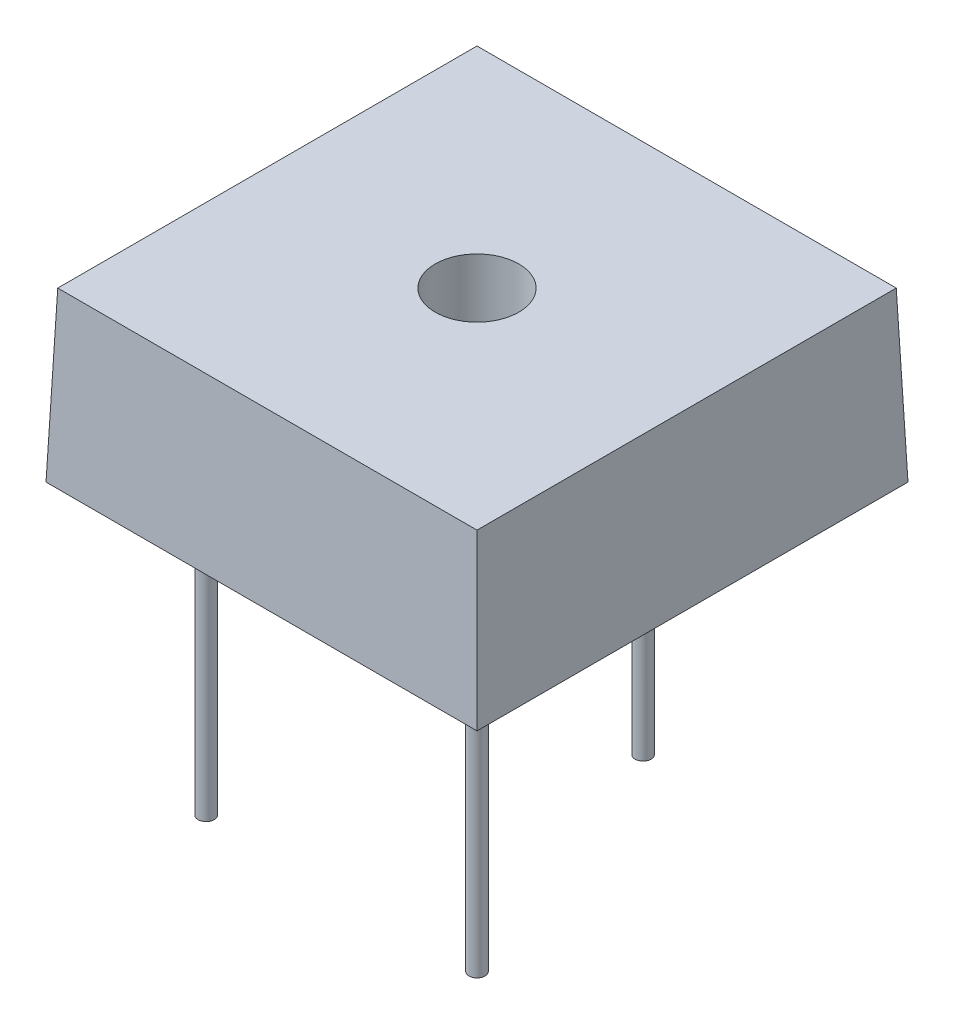
ISO-10303-21;
HEADER;
FILE_DESCRIPTION(('STEP AP214'),'2;1');
FILE_NAME('part.step','',(''),(''),'','','');
FILE_SCHEMA(('AUTOMOTIVE_DESIGN { 1 0 10303 214 1 1 1 1 }'));
ENDSEC;
DATA;
#1=APPLICATION_CONTEXT('core data for automotive mechanical design processes');
#2=APPLICATION_PROTOCOL_DEFINITION('international standard','automotive_design',2000,#1);
#3=PRODUCT_CONTEXT('',#1,'mechanical');
#4=PRODUCT('Part','Part','',(#3));
#5=PRODUCT_RELATED_PRODUCT_CATEGORY('part','',(#4));
#6=PRODUCT_DEFINITION_FORMATION('','',#4);
#7=PRODUCT_DEFINITION_CONTEXT('part definition',#1,'design');
#8=PRODUCT_DEFINITION('design','',#6,#7);
#9=PRODUCT_DEFINITION_SHAPE('','',#8);
#10=(LENGTH_UNIT() NAMED_UNIT(*) SI_UNIT(.MILLI.,.METRE.));
#11=(NAMED_UNIT(*) PLANE_ANGLE_UNIT() SI_UNIT($,.RADIAN.));
#12=(NAMED_UNIT(*) SI_UNIT($,.STERADIAN.) SOLID_ANGLE_UNIT());
#13=UNCERTAINTY_MEASURE_WITH_UNIT(LENGTH_MEASURE(1.E-05),#10,'distance_accuracy_value','');
#14=(GEOMETRIC_REPRESENTATION_CONTEXT(3) GLOBAL_UNCERTAINTY_ASSIGNED_CONTEXT((#13)) GLOBAL_UNIT_ASSIGNED_CONTEXT((#10,
#11,#12)) REPRESENTATION_CONTEXT('',''));
#15=CARTESIAN_POINT('',(0.,0.,0.));
#16=DIRECTION('',(0.,0.,1.));
#17=DIRECTION('',(1.,0.,0.));
#18=AXIS2_PLACEMENT_3D('',#15,#16,#17);
#19=CARTESIAN_POINT('',(0.,0.,-14.4));
#20=DIRECTION('',(0.,0.034899496702501,-0.999390827019096));
#21=DIRECTION('',(0.,0.999390827019096,0.034899496702501));
#22=AXIS2_PLACEMENT_3D('',#19,#20,#21);
#23=PLANE('',#22);
#24=DIRECTION('',(1.,0.,0.));
#25=VECTOR('',#24,1.);
#26=CARTESIAN_POINT('',(0.,0.,-14.4));
#27=LINE('',#26,#25);
#28=CARTESIAN_POINT('',(-14.4,0.,-14.4));
#29=VERTEX_POINT('',#28);
#30=CARTESIAN_POINT('',(14.4,0.,-14.4));
#31=VERTEX_POINT('',#30);
#32=EDGE_CURVE('E141',#29,#31,#27,.T.);
#33=ORIENTED_EDGE('',*,*,#32,.F.);
#34=DIRECTION('',(-0.0348782627423747,-0.998782765958718,-0.0348782627423747));
#35=VECTOR('',#34,1.);
#36=CARTESIAN_POINT('',(-14.3824824977483,0.50163563136476,-14.3824824977483));
#37=LINE('',#36,#35);
#38=CARTESIAN_POINT('',(-14.0078397586077,11.23,-14.0078397586077));
#39=VERTEX_POINT('',#38);
#40=EDGE_CURVE('E156',#39,#29,#37,.T.);
#41=ORIENTED_EDGE('',*,*,#40,.F.);
#42=DIRECTION('',(1.,0.,0.));
#43=VECTOR('',#42,1.);
#44=CARTESIAN_POINT('',(0.,11.23,-14.0078397586077));
#45=LINE('',#44,#43);
#46=CARTESIAN_POINT('',(14.0078397586077,11.23,-14.0078397586077));
#47=VERTEX_POINT('',#46);
#48=EDGE_CURVE('E155',#39,#47,#45,.T.);
#49=ORIENTED_EDGE('',*,*,#48,.T.);
#50=DIRECTION('',(-0.0348782627423747,0.998782765958718,0.0348782627423747));
#51=VECTOR('',#50,1.);
#52=CARTESIAN_POINT('',(14.3824824977483,0.50163563136476,-14.3824824977483));
#53=LINE('',#52,#51);
#54=EDGE_CURVE('E160',#47,#31,#53,.F.);
#55=ORIENTED_EDGE('',*,*,#54,.T.);
#56=EDGE_LOOP('',(#33,#41,#49,#55));
#57=FACE_BOUND('',#56,.T.);
#58=ADVANCED_FACE('F36',(#57),#23,.T.);
#59=CARTESIAN_POINT('',(-14.4,0.,0.));
#60=DIRECTION('',(-0.999390827019096,0.034899496702501,0.));
#61=DIRECTION('',(-0.034899496702501,-0.999390827019096,0.));
#62=AXIS2_PLACEMENT_3D('',#59,#60,#61);
#63=PLANE('',#62);
#64=DIRECTION('',(0.,0.,-1.));
#65=VECTOR('',#64,1.);
#66=CARTESIAN_POINT('',(-14.4,0.,0.));
#67=LINE('',#66,#65);
#68=CARTESIAN_POINT('',(-14.4,0.,14.4));
#69=VERTEX_POINT('',#68);
#70=EDGE_CURVE('E147',#69,#29,#67,.T.);
#71=ORIENTED_EDGE('',*,*,#70,.F.);
#72=DIRECTION('',(0.0348782627423747,0.998782765958718,-0.0348782627423747));
#73=VECTOR('',#72,1.);
#74=CARTESIAN_POINT('',(-14.3824824977483,0.50163563136476,14.3824824977483));
#75=LINE('',#74,#73);
#76=CARTESIAN_POINT('',(-14.0078397586077,11.23,14.0078397586077));
#77=VERTEX_POINT('',#76);
#78=EDGE_CURVE('E159',#77,#69,#75,.F.);
#79=ORIENTED_EDGE('',*,*,#78,.F.);
#80=DIRECTION('',(0.,0.,-1.));
#81=VECTOR('',#80,1.);
#82=CARTESIAN_POINT('',(-14.0078397586077,11.23,0.));
#83=LINE('',#82,#81);
#84=EDGE_CURVE('E168',#77,#39,#83,.T.);
#85=ORIENTED_EDGE('',*,*,#84,.T.);
#86=ORIENTED_EDGE('',*,*,#40,.T.);
#87=EDGE_LOOP('',(#71,#79,#85,#86));
#88=FACE_BOUND('',#87,.T.);
#89=ADVANCED_FACE('F38',(#88),#63,.T.);
#90=CARTESIAN_POINT('',(0.,0.,14.4));
#91=DIRECTION('',(0.,0.034899496702501,0.999390827019096));
#92=DIRECTION('',(0.,-0.999390827019096,0.034899496702501));
#93=AXIS2_PLACEMENT_3D('',#90,#91,#92);
#94=PLANE('',#93);
#95=DIRECTION('',(1.,0.,0.));
#96=VECTOR('',#95,1.);
#97=CARTESIAN_POINT('',(0.,0.,14.4));
#98=LINE('',#97,#96);
#99=CARTESIAN_POINT('',(14.4,0.,14.4));
#100=VERTEX_POINT('',#99);
#101=EDGE_CURVE('E150',#69,#100,#98,.T.);
#102=ORIENTED_EDGE('',*,*,#101,.T.);
#103=DIRECTION('',(0.0348782627423747,-0.998782765958718,0.0348782627423747));
#104=VECTOR('',#103,1.);
#105=CARTESIAN_POINT('',(14.3824824977483,0.50163563136476,14.3824824977483));
#106=LINE('',#105,#104);
#107=CARTESIAN_POINT('',(14.0078397586077,11.23,14.0078397586077));
#108=VERTEX_POINT('',#107);
#109=EDGE_CURVE('E162',#108,#100,#106,.T.);
#110=ORIENTED_EDGE('',*,*,#109,.F.);
#111=DIRECTION('',(-1.,0.,0.));
#112=VECTOR('',#111,1.);
#113=CARTESIAN_POINT('',(0.,11.23,14.0078397586077));
#114=LINE('',#113,#112);
#115=EDGE_CURVE('E171',#77,#108,#114,.F.);
#116=ORIENTED_EDGE('',*,*,#115,.F.);
#117=ORIENTED_EDGE('',*,*,#78,.T.);
#118=EDGE_LOOP('',(#102,#110,#116,#117));
#119=FACE_BOUND('',#118,.T.);
#120=ADVANCED_FACE('F234',(#119),#94,.T.);
#121=CARTESIAN_POINT('',(14.4,0.,0.));
#122=DIRECTION('',(0.999390827019096,0.034899496702501,0.));
#123=DIRECTION('',(-0.034899496702501,0.999390827019096,0.));
#124=AXIS2_PLACEMENT_3D('',#121,#122,#123);
#125=PLANE('',#124);
#126=DIRECTION('',(0.,0.,-1.));
#127=VECTOR('',#126,1.);
#128=CARTESIAN_POINT('',(14.4,0.,0.));
#129=LINE('',#128,#127);
#130=EDGE_CURVE('E152',#100,#31,#129,.T.);
#131=ORIENTED_EDGE('',*,*,#130,.T.);
#132=ORIENTED_EDGE('',*,*,#54,.F.);
#133=DIRECTION('',(0.,0.,1.));
#134=VECTOR('',#133,1.);
#135=CARTESIAN_POINT('',(14.0078397586077,11.23,0.));
#136=LINE('',#135,#134);
#137=EDGE_CURVE('E59',#108,#47,#136,.F.);
#138=ORIENTED_EDGE('',*,*,#137,.F.);
#139=ORIENTED_EDGE('',*,*,#109,.T.);
#140=EDGE_LOOP('',(#131,#132,#138,#139));
#141=FACE_BOUND('',#140,.T.);
#142=ADVANCED_FACE('F241',(#141),#125,.T.);
#143=CARTESIAN_POINT('',(0.,11.23,0.));
#144=DIRECTION('',(0.,1.,0.));
#145=DIRECTION('',(0.,0.,1.));
#146=AXIS2_PLACEMENT_3D('',#143,#144,#145);
#147=PLANE('',#146);
#148=CARTESIAN_POINT('',(0.,11.23,0.));
#149=DIRECTION('',(0.,-1.,0.));
#150=DIRECTION('',(0.,0.,-1.));
#151=AXIS2_PLACEMENT_3D('',#148,#149,#150);
#152=CIRCLE('',#151,2.795);
#153=CARTESIAN_POINT('',(0.,11.23,-2.795));
#154=VERTEX_POINT('',#153);
#155=EDGE_CURVE('E197',#154,#154,#152,.T.);
#156=ORIENTED_EDGE('',*,*,#155,.T.);
#157=EDGE_LOOP('',(#156));
#158=FACE_BOUND('',#157,.T.);
#159=ORIENTED_EDGE('',*,*,#48,.F.);
#160=ORIENTED_EDGE('',*,*,#84,.F.);
#161=ORIENTED_EDGE('',*,*,#115,.T.);
#162=ORIENTED_EDGE('',*,*,#137,.T.);
#163=EDGE_LOOP('',(#159,#160,#161,#162));
#164=FACE_BOUND('',#163,.T.);
#165=ADVANCED_FACE('F243',(#158,#164),#147,.T.);
#166=CARTESIAN_POINT('',(0.,0.,0.));
#167=DIRECTION('',(0.,1.,0.));
#168=DIRECTION('',(0.,0.,1.));
#169=AXIS2_PLACEMENT_3D('',#166,#167,#168);
#170=PLANE('',#169);
#171=DIRECTION('',(1.,0.,0.));
#172=VECTOR('',#171,1.);
#173=CARTESIAN_POINT('',(-13.4,0.,-13.4));
#174=LINE('',#173,#172);
#175=CARTESIAN_POINT('',(-13.4,0.,-13.4));
#176=VERTEX_POINT('',#175);
#177=CARTESIAN_POINT('',(13.4,0.,-13.4));
#178=VERTEX_POINT('',#177);
#179=EDGE_CURVE('E134',#176,#178,#174,.T.);
#180=ORIENTED_EDGE('',*,*,#179,.F.);
#181=DIRECTION('',(0.,0.,-1.));
#182=VECTOR('',#181,1.);
#183=CARTESIAN_POINT('',(-13.4,0.,13.4));
#184=LINE('',#183,#182);
#185=CARTESIAN_POINT('',(-13.4,0.,13.4));
#186=VERTEX_POINT('',#185);
#187=EDGE_CURVE('E51',#186,#176,#184,.T.);
#188=ORIENTED_EDGE('',*,*,#187,.F.);
#189=DIRECTION('',(-1.,0.,0.));
#190=VECTOR('',#189,1.);
#191=CARTESIAN_POINT('',(13.4,0.,13.4));
#192=LINE('',#191,#190);
#193=CARTESIAN_POINT('',(13.4,0.,13.4));
#194=VERTEX_POINT('',#193);
#195=EDGE_CURVE('E122',#194,#186,#192,.T.);
#196=ORIENTED_EDGE('',*,*,#195,.F.);
#197=DIRECTION('',(0.,0.,1.));
#198=VECTOR('',#197,1.);
#199=CARTESIAN_POINT('',(13.4,0.,-13.4));
#200=LINE('',#199,#198);
#201=EDGE_CURVE('E125',#178,#194,#200,.T.);
#202=ORIENTED_EDGE('',*,*,#201,.F.);
#203=EDGE_LOOP('',(#180,#188,#196,#202));
#204=FACE_BOUND('',#203,.T.);
#205=ORIENTED_EDGE('',*,*,#32,.T.);
#206=ORIENTED_EDGE('',*,*,#130,.F.);
#207=ORIENTED_EDGE('',*,*,#101,.F.);
#208=ORIENTED_EDGE('',*,*,#70,.T.);
#209=EDGE_LOOP('',(#205,#206,#207,#208));
#210=FACE_BOUND('',#209,.T.);
#211=ADVANCED_FACE('F239',(#204,#210),#170,.F.);
#212=CARTESIAN_POINT('',(-13.4,0.5,13.4));
#213=DIRECTION('',(-1.,0.,0.));
#214=DIRECTION('',(0.,0.,1.));
#215=AXIS2_PLACEMENT_3D('',#212,#213,#214);
#216=PLANE('',#215);
#217=ORIENTED_EDGE('',*,*,#187,.T.);
#218=DIRECTION('',(0.,-1.,0.));
#219=VECTOR('',#218,1.);
#220=CARTESIAN_POINT('',(-13.4,0.5,-13.4));
#221=LINE('',#220,#219);
#222=CARTESIAN_POINT('',(-13.4,0.5,-13.4));
#223=VERTEX_POINT('',#222);
#224=EDGE_CURVE('E100',#223,#176,#221,.T.);
#225=ORIENTED_EDGE('',*,*,#224,.F.);
#226=DIRECTION('',(0.,0.,-1.));
#227=VECTOR('',#226,1.);
#228=CARTESIAN_POINT('',(-13.4,0.5,13.4));
#229=LINE('',#228,#227);
#230=CARTESIAN_POINT('',(-13.4,0.5,13.4));
#231=VERTEX_POINT('',#230);
#232=EDGE_CURVE('E104',#231,#223,#229,.T.);
#233=ORIENTED_EDGE('',*,*,#232,.F.);
#234=DIRECTION('',(0.,-1.,0.));
#235=VECTOR('',#234,1.);
#236=CARTESIAN_POINT('',(-13.4,0.5,13.4));
#237=LINE('',#236,#235);
#238=EDGE_CURVE('E139',#231,#186,#237,.T.);
#239=ORIENTED_EDGE('',*,*,#238,.T.);
#240=EDGE_LOOP('',(#217,#225,#233,#239));
#241=FACE_BOUND('',#240,.T.);
#242=ADVANCED_FACE('F102',(#241),#216,.F.);
#243=CARTESIAN_POINT('',(13.4,0.5,13.4));
#244=DIRECTION('',(0.,0.,1.));
#245=DIRECTION('',(1.,0.,0.));
#246=AXIS2_PLACEMENT_3D('',#243,#244,#245);
#247=PLANE('',#246);
#248=ORIENTED_EDGE('',*,*,#195,.T.);
#249=ORIENTED_EDGE('',*,*,#238,.F.);
#250=DIRECTION('',(-1.,0.,0.));
#251=VECTOR('',#250,1.);
#252=CARTESIAN_POINT('',(13.4,0.5,13.4));
#253=LINE('',#252,#251);
#254=CARTESIAN_POINT('',(13.4,0.5,13.4));
#255=VERTEX_POINT('',#254);
#256=EDGE_CURVE('E110',#255,#231,#253,.T.);
#257=ORIENTED_EDGE('',*,*,#256,.F.);
#258=DIRECTION('',(0.,-1.,0.));
#259=VECTOR('',#258,1.);
#260=CARTESIAN_POINT('',(13.4,0.5,13.4));
#261=LINE('',#260,#259);
#262=EDGE_CURVE('E142',#255,#194,#261,.T.);
#263=ORIENTED_EDGE('',*,*,#262,.T.);
#264=EDGE_LOOP('',(#248,#249,#257,#263));
#265=FACE_BOUND('',#264,.T.);
#266=ADVANCED_FACE('F266',(#265),#247,.F.);
#267=CARTESIAN_POINT('',(13.4,0.5,-13.4));
#268=DIRECTION('',(1.,0.,0.));
#269=DIRECTION('',(0.,0.,-1.));
#270=AXIS2_PLACEMENT_3D('',#267,#268,#269);
#271=PLANE('',#270);
#272=ORIENTED_EDGE('',*,*,#201,.T.);
#273=ORIENTED_EDGE('',*,*,#262,.F.);
#274=DIRECTION('',(0.,0.,1.));
#275=VECTOR('',#274,1.);
#276=CARTESIAN_POINT('',(13.4,0.5,-13.4));
#277=LINE('',#276,#275);
#278=CARTESIAN_POINT('',(13.4,0.5,-13.4));
#279=VERTEX_POINT('',#278);
#280=EDGE_CURVE('E118',#279,#255,#277,.T.);
#281=ORIENTED_EDGE('',*,*,#280,.F.);
#282=DIRECTION('',(0.,-1.,0.));
#283=VECTOR('',#282,1.);
#284=CARTESIAN_POINT('',(13.4,0.5,-13.4));
#285=LINE('',#284,#283);
#286=EDGE_CURVE('E109',#279,#178,#285,.T.);
#287=ORIENTED_EDGE('',*,*,#286,.T.);
#288=EDGE_LOOP('',(#272,#273,#281,#287));
#289=FACE_BOUND('',#288,.T.);
#290=ADVANCED_FACE('F269',(#289),#271,.F.);
#291=CARTESIAN_POINT('',(-13.4,0.5,-13.4));
#292=DIRECTION('',(0.,0.,-1.));
#293=DIRECTION('',(-1.,0.,0.));
#294=AXIS2_PLACEMENT_3D('',#291,#292,#293);
#295=PLANE('',#294);
#296=ORIENTED_EDGE('',*,*,#179,.T.);
#297=ORIENTED_EDGE('',*,*,#286,.F.);
#298=DIRECTION('',(1.,0.,0.));
#299=VECTOR('',#298,1.);
#300=CARTESIAN_POINT('',(-13.4,0.5,-13.4));
#301=LINE('',#300,#299);
#302=EDGE_CURVE('E113',#223,#279,#301,.T.);
#303=ORIENTED_EDGE('',*,*,#302,.F.);
#304=ORIENTED_EDGE('',*,*,#224,.T.);
#305=EDGE_LOOP('',(#296,#297,#303,#304));
#306=FACE_BOUND('',#305,.T.);
#307=ADVANCED_FACE('F114',(#306),#295,.F.);
#308=CARTESIAN_POINT('',(0.,0.5,0.));
#309=DIRECTION('',(0.,-1.,0.));
#310=DIRECTION('',(0.,0.,-1.));
#311=AXIS2_PLACEMENT_3D('',#308,#309,#310);
#312=PLANE('',#311);
#313=CARTESIAN_POINT('',(2.05,0.5,-9.05));
#314=DIRECTION('',(0.,-1.,0.));
#315=DIRECTION('',(0.,0.,-1.));
#316=AXIS2_PLACEMENT_3D('',#313,#314,#315);
#317=CIRCLE('',#316,0.534999999999999);
#318=CARTESIAN_POINT('',(2.05,0.5,-9.585));
#319=VERTEX_POINT('',#318);
#320=EDGE_CURVE('E11',#319,#319,#317,.T.);
#321=ORIENTED_EDGE('',*,*,#320,.F.);
#322=EDGE_LOOP('',(#321));
#323=FACE_BOUND('',#322,.T.);
#324=CARTESIAN_POINT('',(-9.05,0.5,-9.05));
#325=DIRECTION('',(0.,-1.,0.));
#326=DIRECTION('',(0.,0.,-1.));
#327=AXIS2_PLACEMENT_3D('',#324,#325,#326);
#328=CIRCLE('',#327,0.534999999999999);
#329=CARTESIAN_POINT('',(-9.05,0.5,-9.585));
#330=VERTEX_POINT('',#329);
#331=EDGE_CURVE('E44',#330,#330,#328,.T.);
#332=ORIENTED_EDGE('',*,*,#331,.F.);
#333=EDGE_LOOP('',(#332));
#334=FACE_BOUND('',#333,.T.);
#335=CARTESIAN_POINT('',(9.05,0.5,9.05));
#336=DIRECTION('',(0.,-1.,0.));
#337=DIRECTION('',(0.,0.,-1.));
#338=AXIS2_PLACEMENT_3D('',#335,#336,#337);
#339=CIRCLE('',#338,0.534999999999999);
#340=CARTESIAN_POINT('',(9.05,0.5,8.515));
#341=VERTEX_POINT('',#340);
#342=EDGE_CURVE('E176',#341,#341,#339,.T.);
#343=ORIENTED_EDGE('',*,*,#342,.F.);
#344=EDGE_LOOP('',(#343));
#345=FACE_BOUND('',#344,.T.);
#346=CARTESIAN_POINT('',(-9.05,0.5,9.05));
#347=DIRECTION('',(0.,-1.,0.));
#348=DIRECTION('',(0.,0.,-1.));
#349=AXIS2_PLACEMENT_3D('',#346,#347,#348);
#350=CIRCLE('',#349,0.534999999999999);
#351=CARTESIAN_POINT('',(-9.05,0.5,8.515));
#352=VERTEX_POINT('',#351);
#353=EDGE_CURVE('E158',#352,#352,#350,.T.);
#354=ORIENTED_EDGE('',*,*,#353,.F.);
#355=EDGE_LOOP('',(#354));
#356=FACE_BOUND('',#355,.T.);
#357=CARTESIAN_POINT('',(0.,0.5,0.));
#358=DIRECTION('',(0.,-1.,0.));
#359=DIRECTION('',(0.,0.,-1.));
#360=AXIS2_PLACEMENT_3D('',#357,#358,#359);
#361=CIRCLE('',#360,3.795);
#362=CARTESIAN_POINT('',(0.,0.5,-3.795));
#363=VERTEX_POINT('',#362);
#364=EDGE_CURVE('E135',#363,#363,#361,.T.);
#365=ORIENTED_EDGE('',*,*,#364,.F.);
#366=EDGE_LOOP('',(#365));
#367=FACE_BOUND('',#366,.T.);
#368=ORIENTED_EDGE('',*,*,#232,.T.);
#369=ORIENTED_EDGE('',*,*,#302,.T.);
#370=ORIENTED_EDGE('',*,*,#280,.T.);
#371=ORIENTED_EDGE('',*,*,#256,.T.);
#372=EDGE_LOOP('',(#368,#369,#370,#371));
#373=FACE_BOUND('',#372,.T.);
#374=ADVANCED_FACE('F120',(#323,#334,#345,#356,#367,#373),#312,.T.);
#375=CARTESIAN_POINT('',(0.,0.5,0.));
#376=DIRECTION('',(0.,-1.,0.));
#377=DIRECTION('',(0.,0.,-1.));
#378=AXIS2_PLACEMENT_3D('',#375,#376,#377);
#379=CYLINDRICAL_SURFACE('',#378,3.795);
#380=ORIENTED_EDGE('',*,*,#364,.T.);
#381=EDGE_LOOP('',(#380));
#382=FACE_BOUND('',#381,.T.);
#383=CARTESIAN_POINT('',(0.,0.,0.));
#384=DIRECTION('',(0.,-1.,0.));
#385=DIRECTION('',(0.,0.,-1.));
#386=AXIS2_PLACEMENT_3D('',#383,#384,#385);
#387=CIRCLE('',#386,3.795);
#388=CARTESIAN_POINT('',(0.,0.,-3.795));
#389=VERTEX_POINT('',#388);
#390=EDGE_CURVE('E128',#389,#389,#387,.T.);
#391=ORIENTED_EDGE('',*,*,#390,.F.);
#392=EDGE_LOOP('',(#391));
#393=FACE_BOUND('',#392,.T.);
#394=ADVANCED_FACE('F186',(#382,#393),#379,.T.);
#395=CARTESIAN_POINT('',(0.,0.,0.));
#396=DIRECTION('',(0.,-1.,0.));
#397=DIRECTION('',(0.,0.,-1.));
#398=AXIS2_PLACEMENT_3D('',#395,#396,#397);
#399=CIRCLE('',#398,2.795);
#400=CARTESIAN_POINT('',(0.,0.,-2.795));
#401=VERTEX_POINT('',#400);
#402=EDGE_CURVE('E199',#401,#401,#399,.T.);
#403=ORIENTED_EDGE('',*,*,#402,.F.);
#404=EDGE_LOOP('',(#403));
#405=FACE_BOUND('',#404,.T.);
#406=ORIENTED_EDGE('',*,*,#390,.T.);
#407=EDGE_LOOP('',(#406));
#408=FACE_BOUND('',#407,.T.);
#409=ADVANCED_FACE('F262',(#405,#408),#170,.F.);
#410=CARTESIAN_POINT('',(0.,11.23,0.));
#411=DIRECTION('',(0.,-1.,0.));
#412=DIRECTION('',(0.,0.,-1.));
#413=AXIS2_PLACEMENT_3D('',#410,#411,#412);
#414=CYLINDRICAL_SURFACE('',#413,2.795);
#415=ORIENTED_EDGE('',*,*,#155,.F.);
#416=EDGE_LOOP('',(#415));
#417=FACE_BOUND('',#416,.T.);
#418=ORIENTED_EDGE('',*,*,#402,.T.);
#419=EDGE_LOOP('',(#418));
#420=FACE_BOUND('',#419,.T.);
#421=ADVANCED_FACE('F278',(#417,#420),#414,.F.);
#422=CARTESIAN_POINT('',(-9.05,-19.27,9.05));
#423=DIRECTION('',(0.,1.,0.));
#424=DIRECTION('',(0.,0.,1.));
#425=AXIS2_PLACEMENT_3D('',#422,#423,#424);
#426=CYLINDRICAL_SURFACE('',#425,0.534999999999999);
#427=ORIENTED_EDGE('',*,*,#353,.T.);
#428=EDGE_LOOP('',(#427));
#429=FACE_BOUND('',#428,.T.);
#430=CARTESIAN_POINT('',(-9.05,-19.27,9.05));
#431=DIRECTION('',(0.,1.,0.));
#432=DIRECTION('',(0.,0.,1.));
#433=AXIS2_PLACEMENT_3D('',#430,#431,#432);
#434=CIRCLE('',#433,0.534999999999999);
#435=CARTESIAN_POINT('',(-9.05,-19.27,9.585));
#436=VERTEX_POINT('',#435);
#437=EDGE_CURVE('E202',#436,#436,#434,.T.);
#438=ORIENTED_EDGE('',*,*,#437,.T.);
#439=EDGE_LOOP('',(#438));
#440=FACE_BOUND('',#439,.T.);
#441=ADVANCED_FACE('F281',(#429,#440),#426,.T.);
#442=CARTESIAN_POINT('',(-9.05,-19.27,9.05));
#443=DIRECTION('',(0.,1.,0.));
#444=DIRECTION('',(0.,0.,1.));
#445=AXIS2_PLACEMENT_3D('',#442,#443,#444);
#446=PLANE('',#445);
#447=ORIENTED_EDGE('',*,*,#437,.F.);
#448=EDGE_LOOP('',(#447));
#449=FACE_BOUND('',#448,.T.);
#450=ADVANCED_FACE('F285',(#449),#446,.F.);
#451=CARTESIAN_POINT('',(9.05,-19.27,9.05));
#452=DIRECTION('',(0.,1.,0.));
#453=DIRECTION('',(0.,0.,1.));
#454=AXIS2_PLACEMENT_3D('',#451,#452,#453);
#455=CYLINDRICAL_SURFACE('',#454,0.534999999999999);
#456=ORIENTED_EDGE('',*,*,#342,.T.);
#457=EDGE_LOOP('',(#456));
#458=FACE_BOUND('',#457,.T.);
#459=CARTESIAN_POINT('',(9.05,-19.27,9.05));
#460=DIRECTION('',(0.,1.,0.));
#461=DIRECTION('',(0.,0.,1.));
#462=AXIS2_PLACEMENT_3D('',#459,#460,#461);
#463=CIRCLE('',#462,0.534999999999999);
#464=CARTESIAN_POINT('',(9.05,-19.27,9.585));
#465=VERTEX_POINT('',#464);
#466=EDGE_CURVE('E207',#465,#465,#463,.T.);
#467=ORIENTED_EDGE('',*,*,#466,.T.);
#468=EDGE_LOOP('',(#467));
#469=FACE_BOUND('',#468,.T.);
#470=ADVANCED_FACE('F289',(#458,#469),#455,.T.);
#471=CARTESIAN_POINT('',(9.05,-19.27,9.05));
#472=DIRECTION('',(0.,1.,0.));
#473=DIRECTION('',(0.,0.,1.));
#474=AXIS2_PLACEMENT_3D('',#471,#472,#473);
#475=PLANE('',#474);
#476=ORIENTED_EDGE('',*,*,#466,.F.);
#477=EDGE_LOOP('',(#476));
#478=FACE_BOUND('',#477,.T.);
#479=ADVANCED_FACE('F293',(#478),#475,.F.);
#480=CARTESIAN_POINT('',(-9.05,-19.27,-9.05));
#481=DIRECTION('',(0.,1.,0.));
#482=DIRECTION('',(0.,0.,1.));
#483=AXIS2_PLACEMENT_3D('',#480,#481,#482);
#484=CYLINDRICAL_SURFACE('',#483,0.534999999999999);
#485=ORIENTED_EDGE('',*,*,#331,.T.);
#486=EDGE_LOOP('',(#485));
#487=FACE_BOUND('',#486,.T.);
#488=CARTESIAN_POINT('',(-9.05,-19.27,-9.05));
#489=DIRECTION('',(0.,1.,0.));
#490=DIRECTION('',(0.,0.,1.));
#491=AXIS2_PLACEMENT_3D('',#488,#489,#490);
#492=CIRCLE('',#491,0.534999999999999);
#493=CARTESIAN_POINT('',(-9.05,-19.27,-8.515));
#494=VERTEX_POINT('',#493);
#495=EDGE_CURVE('E210',#494,#494,#492,.T.);
#496=ORIENTED_EDGE('',*,*,#495,.T.);
#497=EDGE_LOOP('',(#496));
#498=FACE_BOUND('',#497,.T.);
#499=ADVANCED_FACE('F181',(#487,#498),#484,.T.);
#500=CARTESIAN_POINT('',(-9.05,-19.27,-9.05));
#501=DIRECTION('',(0.,1.,0.));
#502=DIRECTION('',(0.,0.,1.));
#503=AXIS2_PLACEMENT_3D('',#500,#501,#502);
#504=PLANE('',#503);
#505=ORIENTED_EDGE('',*,*,#495,.F.);
#506=EDGE_LOOP('',(#505));
#507=FACE_BOUND('',#506,.T.);
#508=ADVANCED_FACE('F225',(#507),#504,.F.);
#509=CARTESIAN_POINT('',(2.05,-19.27,-9.05));
#510=DIRECTION('',(0.,1.,0.));
#511=DIRECTION('',(0.,0.,1.));
#512=AXIS2_PLACEMENT_3D('',#509,#510,#511);
#513=CYLINDRICAL_SURFACE('',#512,0.534999999999999);
#514=ORIENTED_EDGE('',*,*,#320,.T.);
#515=EDGE_LOOP('',(#514));
#516=FACE_BOUND('',#515,.T.);
#517=CARTESIAN_POINT('',(2.05,-19.27,-9.05));
#518=DIRECTION('',(0.,1.,0.));
#519=DIRECTION('',(0.,0.,1.));
#520=AXIS2_PLACEMENT_3D('',#517,#518,#519);
#521=CIRCLE('',#520,0.534999999999999);
#522=CARTESIAN_POINT('',(2.05,-19.27,-8.515));
#523=VERTEX_POINT('',#522);
#524=EDGE_CURVE('E213',#523,#523,#521,.T.);
#525=ORIENTED_EDGE('',*,*,#524,.T.);
#526=EDGE_LOOP('',(#525));
#527=FACE_BOUND('',#526,.T.);
#528=ADVANCED_FACE('F217',(#516,#527),#513,.T.);
#529=CARTESIAN_POINT('',(2.05,-19.27,-9.05));
#530=DIRECTION('',(0.,1.,0.));
#531=DIRECTION('',(0.,0.,1.));
#532=AXIS2_PLACEMENT_3D('',#529,#530,#531);
#533=PLANE('',#532);
#534=ORIENTED_EDGE('',*,*,#524,.F.);
#535=EDGE_LOOP('',(#534));
#536=FACE_BOUND('',#535,.T.);
#537=ADVANCED_FACE('F219',(#536),#533,.F.);
#538=CLOSED_SHELL('',(#58,#89,#120,#142,#165,#211,#242,#266,#290,#307,#374,#394,#409,#421,#441,
#450,#470,#479,#499,#508,#528,#537));
#539=MANIFOLD_SOLID_BREP('B2',#538);
#540=ADVANCED_BREP_SHAPE_REPRESENTATION('',(#18,#539),#14);
#541=SHAPE_DEFINITION_REPRESENTATION(#9,#540);
ENDSEC;
END-ISO-10303-21;
